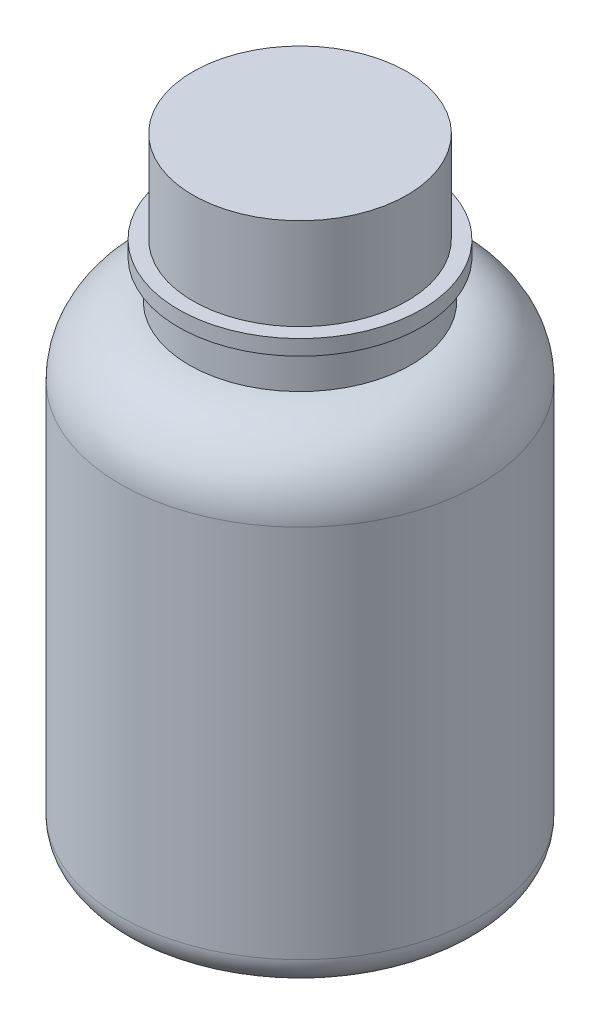
ISO-10303-21;
HEADER;
FILE_DESCRIPTION(('STEP AP214'),'2;1');
FILE_NAME('part.step','',(''),(''),'','','');
FILE_SCHEMA(('AUTOMOTIVE_DESIGN { 1 0 10303 214 1 1 1 1 }'));
ENDSEC;
DATA;
#1=APPLICATION_CONTEXT('core data for automotive mechanical design processes');
#2=APPLICATION_PROTOCOL_DEFINITION('international standard','automotive_design',2000,#1);
#3=PRODUCT_CONTEXT('',#1,'mechanical');
#4=PRODUCT('Part','Part','',(#3));
#5=PRODUCT_RELATED_PRODUCT_CATEGORY('part','',(#4));
#6=PRODUCT_DEFINITION_FORMATION('','',#4);
#7=PRODUCT_DEFINITION_CONTEXT('part definition',#1,'design');
#8=PRODUCT_DEFINITION('design','',#6,#7);
#9=PRODUCT_DEFINITION_SHAPE('','',#8);
#10=(LENGTH_UNIT() NAMED_UNIT(*) SI_UNIT(.MILLI.,.METRE.));
#11=(NAMED_UNIT(*) PLANE_ANGLE_UNIT() SI_UNIT($,.RADIAN.));
#12=(NAMED_UNIT(*) SI_UNIT($,.STERADIAN.) SOLID_ANGLE_UNIT());
#13=UNCERTAINTY_MEASURE_WITH_UNIT(LENGTH_MEASURE(1.E-05),#10,'distance_accuracy_value','');
#14=(GEOMETRIC_REPRESENTATION_CONTEXT(3) GLOBAL_UNCERTAINTY_ASSIGNED_CONTEXT((#13)) GLOBAL_UNIT_ASSIGNED_CONTEXT((#10,
#11,#12)) REPRESENTATION_CONTEXT('',''));
#15=CARTESIAN_POINT('',(0.,0.,0.));
#16=DIRECTION('',(0.,0.,1.));
#17=DIRECTION('',(1.,0.,0.));
#18=AXIS2_PLACEMENT_3D('',#15,#16,#17);
#19=CARTESIAN_POINT('',(0.,28.,0.));
#20=DIRECTION('',(0.,-1.,0.));
#21=DIRECTION('',(0.,0.,-1.));
#22=AXIS2_PLACEMENT_3D('',#19,#20,#21);
#23=TOROIDAL_SURFACE('',#22,14.5,9.);
#24=CARTESIAN_POINT('',(0.,27.9999999999999,0.));
#25=DIRECTION('',(0.,-1.,0.));
#26=DIRECTION('',(0.,0.,-1.));
#27=AXIS2_PLACEMENT_3D('',#24,#25,#26);
#28=CIRCLE('',#27,23.5);
#29=CARTESIAN_POINT('',(0.,27.9999999999999,-23.5));
#30=VERTEX_POINT('',#29);
#31=EDGE_CURVE('E66',#30,#30,#28,.T.);
#32=ORIENTED_EDGE('',*,*,#31,.F.);
#33=EDGE_LOOP('',(#32));
#34=FACE_BOUND('',#33,.T.);
#35=CARTESIAN_POINT('',(0.,37.,0.));
#36=DIRECTION('',(0.,-1.,0.));
#37=DIRECTION('',(0.,0.,-1.));
#38=AXIS2_PLACEMENT_3D('',#35,#36,#37);
#39=CIRCLE('',#38,14.4999999999999);
#40=CARTESIAN_POINT('',(0.,37.,-14.4999999999999));
#41=VERTEX_POINT('',#40);
#42=EDGE_CURVE('E10',#41,#41,#39,.T.);
#43=ORIENTED_EDGE('',*,*,#42,.T.);
#44=EDGE_LOOP('',(#43));
#45=FACE_BOUND('',#44,.T.);
#46=ADVANCED_FACE('F35',(#34,#45),#23,.T.);
#47=CARTESIAN_POINT('',(0.,0.,0.));
#48=DIRECTION('',(0.,-1.,0.));
#49=DIRECTION('',(0.,0.,-1.));
#50=AXIS2_PLACEMENT_3D('',#47,#48,#49);
#51=CYLINDRICAL_SURFACE('',#50,14.4999999999999);
#52=ORIENTED_EDGE('',*,*,#42,.F.);
#53=EDGE_LOOP('',(#52));
#54=FACE_BOUND('',#53,.T.);
#55=CARTESIAN_POINT('',(0.,42.,0.));
#56=DIRECTION('',(0.,-1.,0.));
#57=DIRECTION('',(0.,0.,-1.));
#58=AXIS2_PLACEMENT_3D('',#55,#56,#57);
#59=CIRCLE('',#58,14.4999999999999);
#60=CARTESIAN_POINT('',(0.,42.,-14.4999999999999));
#61=VERTEX_POINT('',#60);
#62=EDGE_CURVE('E41',#61,#61,#59,.T.);
#63=ORIENTED_EDGE('',*,*,#62,.T.);
#64=EDGE_LOOP('',(#63));
#65=FACE_BOUND('',#64,.T.);
#66=ADVANCED_FACE('F74',(#54,#65),#51,.T.);
#67=CARTESIAN_POINT('',(-2.06832443537463E-13,42.,0.));
#68=DIRECTION('',(0.,1.,0.));
#69=DIRECTION('',(0.,0.,1.));
#70=AXIS2_PLACEMENT_3D('',#67,#68,#69);
#71=PLANE('',#70);
#72=ORIENTED_EDGE('',*,*,#62,.F.);
#73=EDGE_LOOP('',(#72));
#74=FACE_BOUND('',#73,.T.);
#75=CARTESIAN_POINT('',(0.,42.,0.));
#76=DIRECTION('',(0.,-1.,0.));
#77=DIRECTION('',(0.,0.,-1.));
#78=AXIS2_PLACEMENT_3D('',#75,#76,#77);
#79=CIRCLE('',#78,15.909032059863);
#80=CARTESIAN_POINT('',(0.,42.,-15.909032059863));
#81=VERTEX_POINT('',#80);
#82=EDGE_CURVE('E45',#81,#81,#79,.T.);
#83=ORIENTED_EDGE('',*,*,#82,.T.);
#84=EDGE_LOOP('',(#83));
#85=FACE_BOUND('',#84,.T.);
#86=ADVANCED_FACE('F78',(#74,#85),#71,.F.);
#87=CARTESIAN_POINT('',(0.,0.,0.));
#88=DIRECTION('',(0.,-1.,0.));
#89=DIRECTION('',(0.,0.,-1.));
#90=AXIS2_PLACEMENT_3D('',#87,#88,#89);
#91=CYLINDRICAL_SURFACE('',#90,15.909032059863);
#92=ORIENTED_EDGE('',*,*,#82,.F.);
#93=EDGE_LOOP('',(#92));
#94=FACE_BOUND('',#93,.T.);
#95=CARTESIAN_POINT('',(0.,44.,0.));
#96=DIRECTION('',(0.,-1.,0.));
#97=DIRECTION('',(0.,0.,-1.));
#98=AXIS2_PLACEMENT_3D('',#95,#96,#97);
#99=CIRCLE('',#98,15.909032059863);
#100=CARTESIAN_POINT('',(0.,44.,-15.909032059863));
#101=VERTEX_POINT('',#100);
#102=EDGE_CURVE('E49',#101,#101,#99,.T.);
#103=ORIENTED_EDGE('',*,*,#102,.T.);
#104=EDGE_LOOP('',(#103));
#105=FACE_BOUND('',#104,.T.);
#106=ADVANCED_FACE('F83',(#94,#105),#91,.T.);
#107=CARTESIAN_POINT('',(1.59929913274388E-13,44.,0.));
#108=DIRECTION('',(0.,1.,0.));
#109=DIRECTION('',(0.,0.,1.));
#110=AXIS2_PLACEMENT_3D('',#107,#108,#109);
#111=PLANE('',#110);
#112=CARTESIAN_POINT('',(0.,44.,0.));
#113=DIRECTION('',(0.,-1.,0.));
#114=DIRECTION('',(0.,0.,-1.));
#115=AXIS2_PLACEMENT_3D('',#112,#113,#114);
#116=CIRCLE('',#115,14.);
#117=CARTESIAN_POINT('',(0.,44.,-14.));
#118=VERTEX_POINT('',#117);
#119=EDGE_CURVE('E54',#118,#118,#116,.T.);
#120=ORIENTED_EDGE('',*,*,#119,.T.);
#121=EDGE_LOOP('',(#120));
#122=FACE_BOUND('',#121,.T.);
#123=ORIENTED_EDGE('',*,*,#102,.F.);
#124=EDGE_LOOP('',(#123));
#125=FACE_BOUND('',#124,.T.);
#126=ADVANCED_FACE('F89',(#122,#125),#111,.T.);
#127=CARTESIAN_POINT('',(0.,0.,0.));
#128=DIRECTION('',(0.,-1.,0.));
#129=DIRECTION('',(0.,0.,-1.));
#130=AXIS2_PLACEMENT_3D('',#127,#128,#129);
#131=CYLINDRICAL_SURFACE('',#130,14.);
#132=CARTESIAN_POINT('',(0.,56.,0.));
#133=DIRECTION('',(0.,-1.,0.));
#134=DIRECTION('',(0.,0.,-1.));
#135=AXIS2_PLACEMENT_3D('',#132,#133,#134);
#136=CIRCLE('',#135,14.);
#137=CARTESIAN_POINT('',(0.,56.,-14.));
#138=VERTEX_POINT('',#137);
#139=EDGE_CURVE('E57',#138,#138,#136,.T.);
#140=ORIENTED_EDGE('',*,*,#139,.T.);
#141=EDGE_LOOP('',(#140));
#142=FACE_BOUND('',#141,.T.);
#143=ORIENTED_EDGE('',*,*,#119,.F.);
#144=EDGE_LOOP('',(#143));
#145=FACE_BOUND('',#144,.T.);
#146=ADVANCED_FACE('F93',(#142,#145),#131,.T.);
#147=CARTESIAN_POINT('',(0.,56.,0.));
#148=DIRECTION('',(0.,-1.,0.));
#149=DIRECTION('',(0.,0.,-1.));
#150=AXIS2_PLACEMENT_3D('',#147,#148,#149);
#151=PLANE('',#150);
#152=ORIENTED_EDGE('',*,*,#139,.F.);
#153=EDGE_LOOP('',(#152));
#154=FACE_BOUND('',#153,.T.);
#155=ADVANCED_FACE('F97',(#154),#151,.F.);
#156=CARTESIAN_POINT('',(0.,-25.,0.));
#157=DIRECTION('',(0.,-1.,0.));
#158=DIRECTION('',(0.,0.,-1.));
#159=AXIS2_PLACEMENT_3D('',#156,#157,#158);
#160=PLANE('',#159);
#161=CARTESIAN_POINT('',(0.,-25.,0.));
#162=DIRECTION('',(0.,-1.,0.));
#163=DIRECTION('',(0.,0.,-1.));
#164=AXIS2_PLACEMENT_3D('',#161,#162,#163);
#165=CIRCLE('',#164,19.5);
#166=CARTESIAN_POINT('',(0.,-25.,-19.5));
#167=VERTEX_POINT('',#166);
#168=EDGE_CURVE('E60',#167,#167,#165,.T.);
#169=ORIENTED_EDGE('',*,*,#168,.T.);
#170=EDGE_LOOP('',(#169));
#171=FACE_BOUND('',#170,.T.);
#172=ADVANCED_FACE('F101',(#171),#160,.T.);
#173=CARTESIAN_POINT('',(0.,-21.,0.));
#174=DIRECTION('',(0.,-1.,0.));
#175=DIRECTION('',(0.,0.,-1.));
#176=AXIS2_PLACEMENT_3D('',#173,#174,#175);
#177=TOROIDAL_SURFACE('',#176,19.5,4.);
#178=CARTESIAN_POINT('',(0.,-21.,0.));
#179=DIRECTION('',(0.,-1.,0.));
#180=DIRECTION('',(0.,0.,-1.));
#181=AXIS2_PLACEMENT_3D('',#178,#179,#180);
#182=CIRCLE('',#181,23.5);
#183=CARTESIAN_POINT('',(0.,-21.,-23.5));
#184=VERTEX_POINT('',#183);
#185=EDGE_CURVE('E63',#184,#184,#182,.T.);
#186=ORIENTED_EDGE('',*,*,#185,.T.);
#187=EDGE_LOOP('',(#186));
#188=FACE_BOUND('',#187,.T.);
#189=ORIENTED_EDGE('',*,*,#168,.F.);
#190=EDGE_LOOP('',(#189));
#191=FACE_BOUND('',#190,.T.);
#192=ADVANCED_FACE('F105',(#188,#191),#177,.T.);
#193=CARTESIAN_POINT('',(0.,0.,0.));
#194=DIRECTION('',(0.,-1.,0.));
#195=DIRECTION('',(0.,0.,-1.));
#196=AXIS2_PLACEMENT_3D('',#193,#194,#195);
#197=CYLINDRICAL_SURFACE('',#196,23.5);
#198=ORIENTED_EDGE('',*,*,#31,.T.);
#199=EDGE_LOOP('',(#198));
#200=FACE_BOUND('',#199,.T.);
#201=ORIENTED_EDGE('',*,*,#185,.F.);
#202=EDGE_LOOP('',(#201));
#203=FACE_BOUND('',#202,.T.);
#204=ADVANCED_FACE('F70',(#200,#203),#197,.T.);
#205=CLOSED_SHELL('',(#46,#66,#86,#106,#126,#146,#155,#172,#192,#204));
#206=MANIFOLD_SOLID_BREP('B2',#205);
#207=ADVANCED_BREP_SHAPE_REPRESENTATION('',(#18,#206),#14);
#208=SHAPE_DEFINITION_REPRESENTATION(#9,#207);
ENDSEC;
END-ISO-10303-21;
